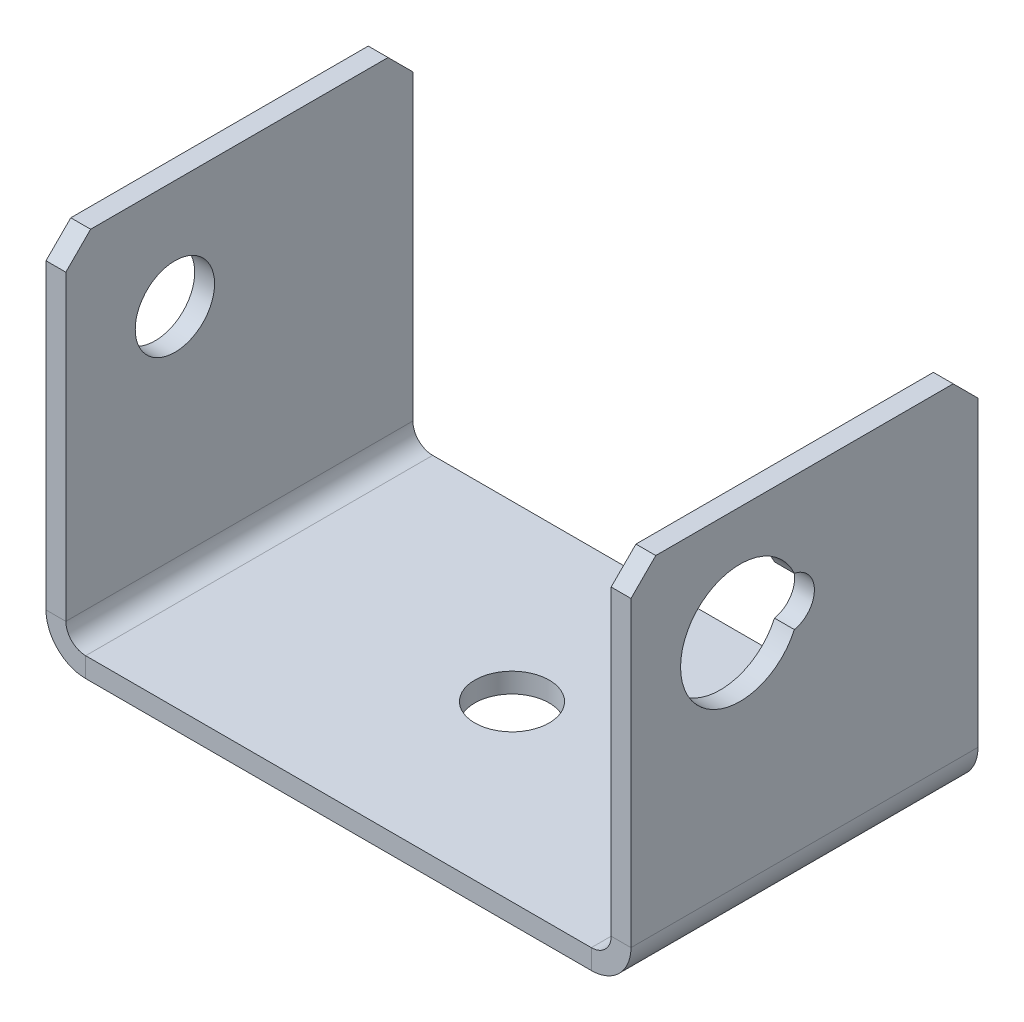
ISO-10303-21;
HEADER;
FILE_DESCRIPTION(('STEP AP214'),'2;1');
FILE_NAME('part.step','',(''),(''),'','','');
FILE_SCHEMA(('AUTOMOTIVE_DESIGN { 1 0 10303 214 1 1 1 1 }'));
ENDSEC;
DATA;
#1=APPLICATION_CONTEXT('core data for automotive mechanical design processes');
#2=APPLICATION_PROTOCOL_DEFINITION('international standard','automotive_design',2000,#1);
#3=PRODUCT_CONTEXT('',#1,'mechanical');
#4=PRODUCT('Part','Part','',(#3));
#5=PRODUCT_RELATED_PRODUCT_CATEGORY('part','',(#4));
#6=PRODUCT_DEFINITION_FORMATION('','',#4);
#7=PRODUCT_DEFINITION_CONTEXT('part definition',#1,'design');
#8=PRODUCT_DEFINITION('design','',#6,#7);
#9=PRODUCT_DEFINITION_SHAPE('','',#8);
#10=(LENGTH_UNIT() NAMED_UNIT(*) SI_UNIT(.MILLI.,.METRE.));
#11=(NAMED_UNIT(*) PLANE_ANGLE_UNIT() SI_UNIT($,.RADIAN.));
#12=(NAMED_UNIT(*) SI_UNIT($,.STERADIAN.) SOLID_ANGLE_UNIT());
#13=UNCERTAINTY_MEASURE_WITH_UNIT(LENGTH_MEASURE(1.E-05),#10,'distance_accuracy_value','');
#14=(GEOMETRIC_REPRESENTATION_CONTEXT(3) GLOBAL_UNCERTAINTY_ASSIGNED_CONTEXT((#13)) GLOBAL_UNIT_ASSIGNED_CONTEXT((#10,
#11,#12)) REPRESENTATION_CONTEXT('',''));
#15=CARTESIAN_POINT('',(0.,0.,0.));
#16=DIRECTION('',(0.,0.,1.));
#17=DIRECTION('',(1.,0.,0.));
#18=AXIS2_PLACEMENT_3D('',#15,#16,#17);
#19=CARTESIAN_POINT('',(2.,-35.,35.));
#20=DIRECTION('',(0.,0.,1.));
#21=DIRECTION('',(1.,0.,0.));
#22=AXIS2_PLACEMENT_3D('',#19,#20,#21);
#23=PLANE('',#22);
#24=DIRECTION('',(0.,-1.,0.));
#25=VECTOR('',#24,1.);
#26=CARTESIAN_POINT('',(2.,-35.,35.));
#27=LINE('',#26,#25);
#28=CARTESIAN_POINT('',(2.,-35.,35.));
#29=VERTEX_POINT('',#28);
#30=CARTESIAN_POINT('',(2.,-37.,35.));
#31=VERTEX_POINT('',#30);
#32=EDGE_CURVE('E304',#29,#31,#27,.T.);
#33=ORIENTED_EDGE('',*,*,#32,.F.);
#34=CARTESIAN_POINT('',(2.,-33.,35.));
#35=DIRECTION('',(0.,0.,-1.));
#36=DIRECTION('',(-1.,0.,0.));
#37=AXIS2_PLACEMENT_3D('',#34,#35,#36);
#38=CIRCLE('',#37,2.);
#39=CARTESIAN_POINT('',(0.,-33.,35.));
#40=VERTEX_POINT('',#39);
#41=EDGE_CURVE('E212',#40,#29,#38,.F.);
#42=ORIENTED_EDGE('',*,*,#41,.F.);
#43=DIRECTION('',(1.,0.,0.));
#44=VECTOR('',#43,1.);
#45=CARTESIAN_POINT('',(-2.,-33.,35.));
#46=LINE('',#45,#44);
#47=CARTESIAN_POINT('',(-2.,-33.,35.));
#48=VERTEX_POINT('',#47);
#49=EDGE_CURVE('E301',#48,#40,#46,.T.);
#50=ORIENTED_EDGE('',*,*,#49,.F.);
#51=CARTESIAN_POINT('',(2.,-33.,35.));
#52=DIRECTION('',(0.,0.,1.));
#53=DIRECTION('',(1.,0.,0.));
#54=AXIS2_PLACEMENT_3D('',#51,#52,#53);
#55=CIRCLE('',#54,4.);
#56=EDGE_CURVE('E219',#48,#31,#55,.T.);
#57=ORIENTED_EDGE('',*,*,#56,.T.);
#58=EDGE_LOOP('',(#33,#42,#50,#57));
#59=FACE_BOUND('',#58,.T.);
#60=ADVANCED_FACE('F45',(#59),#23,.T.);
#61=CARTESIAN_POINT('',(-2.,-33.,35.));
#62=DIRECTION('',(0.,0.,1.));
#63=DIRECTION('',(1.,0.,0.));
#64=AXIS2_PLACEMENT_3D('',#61,#62,#63);
#65=PLANE('',#64);
#66=DIRECTION('',(1.,0.,0.));
#67=VECTOR('',#66,1.);
#68=CARTESIAN_POINT('',(0.,-35.,35.));
#69=LINE('',#68,#67);
#70=CARTESIAN_POINT('',(53.,-35.,35.));
#71=VERTEX_POINT('',#70);
#72=EDGE_CURVE('E209',#29,#71,#69,.T.);
#73=ORIENTED_EDGE('',*,*,#72,.F.);
#74=ORIENTED_EDGE('',*,*,#32,.T.);
#75=DIRECTION('',(1.,0.,0.));
#76=VECTOR('',#75,1.);
#77=CARTESIAN_POINT('',(0.,-37.,35.));
#78=LINE('',#77,#76);
#79=CARTESIAN_POINT('',(53.,-37.,35.));
#80=VERTEX_POINT('',#79);
#81=EDGE_CURVE('E222',#31,#80,#78,.T.);
#82=ORIENTED_EDGE('',*,*,#81,.T.);
#83=DIRECTION('',(0.,1.,0.));
#84=VECTOR('',#83,1.);
#85=CARTESIAN_POINT('',(53.,-37.,35.));
#86=LINE('',#85,#84);
#87=EDGE_CURVE('E292',#80,#71,#86,.T.);
#88=ORIENTED_EDGE('',*,*,#87,.T.);
#89=EDGE_LOOP('',(#73,#74,#82,#88));
#90=FACE_BOUND('',#89,.T.);
#91=ADVANCED_FACE('F371',(#90),#65,.T.);
#92=CARTESIAN_POINT('',(0.,-33.,0.));
#93=DIRECTION('',(0.,0.,-1.));
#94=DIRECTION('',(-1.,0.,0.));
#95=AXIS2_PLACEMENT_3D('',#92,#93,#94);
#96=PLANE('',#95);
#97=DIRECTION('',(-1.,0.,0.));
#98=VECTOR('',#97,1.);
#99=CARTESIAN_POINT('',(0.,-33.,0.));
#100=LINE('',#99,#98);
#101=CARTESIAN_POINT('',(0.,-33.,0.));
#102=VERTEX_POINT('',#101);
#103=CARTESIAN_POINT('',(-2.,-33.,0.));
#104=VERTEX_POINT('',#103);
#105=EDGE_CURVE('E298',#102,#104,#100,.T.);
#106=ORIENTED_EDGE('',*,*,#105,.F.);
#107=CARTESIAN_POINT('',(2.,-33.,0.));
#108=DIRECTION('',(0.,0.,-1.));
#109=DIRECTION('',(-1.,0.,0.));
#110=AXIS2_PLACEMENT_3D('',#107,#108,#109);
#111=CIRCLE('',#110,2.);
#112=CARTESIAN_POINT('',(2.,-35.,0.));
#113=VERTEX_POINT('',#112);
#114=EDGE_CURVE('E240',#102,#113,#111,.F.);
#115=ORIENTED_EDGE('',*,*,#114,.T.);
#116=DIRECTION('',(0.,1.,0.));
#117=VECTOR('',#116,1.);
#118=CARTESIAN_POINT('',(2.,-37.,0.));
#119=LINE('',#118,#117);
#120=CARTESIAN_POINT('',(2.,-37.,0.));
#121=VERTEX_POINT('',#120);
#122=EDGE_CURVE('E296',#121,#113,#119,.T.);
#123=ORIENTED_EDGE('',*,*,#122,.F.);
#124=CARTESIAN_POINT('',(2.,-33.,0.));
#125=DIRECTION('',(0.,0.,1.));
#126=DIRECTION('',(1.,0.,0.));
#127=AXIS2_PLACEMENT_3D('',#124,#125,#126);
#128=CIRCLE('',#127,4.);
#129=EDGE_CURVE('E247',#104,#121,#128,.T.);
#130=ORIENTED_EDGE('',*,*,#129,.F.);
#131=EDGE_LOOP('',(#106,#115,#123,#130));
#132=FACE_BOUND('',#131,.T.);
#133=ADVANCED_FACE('F429',(#132),#96,.T.);
#134=CARTESIAN_POINT('',(2.,-37.,0.));
#135=DIRECTION('',(0.,0.,-1.));
#136=DIRECTION('',(-1.,0.,0.));
#137=AXIS2_PLACEMENT_3D('',#134,#135,#136);
#138=PLANE('',#137);
#139=DIRECTION('',(0.,1.,0.));
#140=VECTOR('',#139,1.);
#141=CARTESIAN_POINT('',(-2.,0.,0.));
#142=LINE('',#141,#140);
#143=CARTESIAN_POINT('',(-2.,-2.5,0.));
#144=VERTEX_POINT('',#143);
#145=EDGE_CURVE('E245',#144,#104,#142,.F.);
#146=ORIENTED_EDGE('',*,*,#145,.F.);
#147=DIRECTION('',(1.,0.,0.));
#148=VECTOR('',#147,1.);
#149=CARTESIAN_POINT('',(2.,-2.5,0.));
#150=LINE('',#149,#148);
#151=CARTESIAN_POINT('',(0.,-2.5,0.));
#152=VERTEX_POINT('',#151);
#153=EDGE_CURVE('E324',#144,#152,#150,.T.);
#154=ORIENTED_EDGE('',*,*,#153,.T.);
#155=DIRECTION('',(0.,-1.,0.));
#156=VECTOR('',#155,1.);
#157=CARTESIAN_POINT('',(0.,0.,0.));
#158=LINE('',#157,#156);
#159=EDGE_CURVE('E243',#152,#102,#158,.T.);
#160=ORIENTED_EDGE('',*,*,#159,.T.);
#161=ORIENTED_EDGE('',*,*,#105,.T.);
#162=EDGE_LOOP('',(#146,#154,#160,#161));
#163=FACE_BOUND('',#162,.T.);
#164=ADVANCED_FACE('F344',(#163),#138,.T.);
#165=CARTESIAN_POINT('',(55.,-33.,35.));
#166=DIRECTION('',(0.,0.,1.));
#167=DIRECTION('',(1.,0.,0.));
#168=AXIS2_PLACEMENT_3D('',#165,#166,#167);
#169=PLANE('',#168);
#170=DIRECTION('',(1.,0.,0.));
#171=VECTOR('',#170,1.);
#172=CARTESIAN_POINT('',(55.,-33.,35.));
#173=LINE('',#172,#171);
#174=CARTESIAN_POINT('',(55.,-33.,35.));
#175=VERTEX_POINT('',#174);
#176=CARTESIAN_POINT('',(57.,-33.,35.));
#177=VERTEX_POINT('',#176);
#178=EDGE_CURVE('E294',#175,#177,#173,.T.);
#179=ORIENTED_EDGE('',*,*,#178,.F.);
#180=CARTESIAN_POINT('',(53.,-33.,35.));
#181=DIRECTION('',(0.,0.,-1.));
#182=DIRECTION('',(-1.,0.,0.));
#183=AXIS2_PLACEMENT_3D('',#180,#181,#182);
#184=CIRCLE('',#183,2.);
#185=EDGE_CURVE('E206',#71,#175,#184,.F.);
#186=ORIENTED_EDGE('',*,*,#185,.F.);
#187=ORIENTED_EDGE('',*,*,#87,.F.);
#188=CARTESIAN_POINT('',(53.,-33.,35.));
#189=DIRECTION('',(0.,0.,1.));
#190=DIRECTION('',(1.,0.,0.));
#191=AXIS2_PLACEMENT_3D('',#188,#189,#190);
#192=CIRCLE('',#191,4.);
#193=EDGE_CURVE('E225',#80,#177,#192,.T.);
#194=ORIENTED_EDGE('',*,*,#193,.T.);
#195=EDGE_LOOP('',(#179,#186,#187,#194));
#196=FACE_BOUND('',#195,.T.);
#197=ADVANCED_FACE('F380',(#196),#169,.T.);
#198=CARTESIAN_POINT('',(53.,-37.,35.));
#199=DIRECTION('',(0.,0.,1.));
#200=DIRECTION('',(1.,0.,0.));
#201=AXIS2_PLACEMENT_3D('',#198,#199,#200);
#202=PLANE('',#201);
#203=DIRECTION('',(0.,1.,0.));
#204=VECTOR('',#203,1.);
#205=CARTESIAN_POINT('',(57.,-35.,35.));
#206=LINE('',#205,#204);
#207=CARTESIAN_POINT('',(57.,-2.50000000000002,35.));
#208=VERTEX_POINT('',#207);
#209=EDGE_CURVE('E199',#177,#208,#206,.T.);
#210=ORIENTED_EDGE('',*,*,#209,.T.);
#211=DIRECTION('',(-1.,0.,0.));
#212=VECTOR('',#211,1.);
#213=CARTESIAN_POINT('',(53.,-2.50000000000002,35.));
#214=LINE('',#213,#212);
#215=CARTESIAN_POINT('',(55.,-2.50000000000002,35.));
#216=VERTEX_POINT('',#215);
#217=EDGE_CURVE('E315',#208,#216,#214,.T.);
#218=ORIENTED_EDGE('',*,*,#217,.T.);
#219=DIRECTION('',(0.,1.,0.));
#220=VECTOR('',#219,1.);
#221=CARTESIAN_POINT('',(55.,-35.,35.));
#222=LINE('',#221,#220);
#223=EDGE_CURVE('E202',#175,#216,#222,.T.);
#224=ORIENTED_EDGE('',*,*,#223,.F.);
#225=ORIENTED_EDGE('',*,*,#178,.T.);
#226=EDGE_LOOP('',(#210,#218,#224,#225));
#227=FACE_BOUND('',#226,.T.);
#228=ADVANCED_FACE('F390',(#227),#202,.T.);
#229=CARTESIAN_POINT('',(53.,-35.,0.));
#230=DIRECTION('',(0.,0.,-1.));
#231=DIRECTION('',(-1.,0.,0.));
#232=AXIS2_PLACEMENT_3D('',#229,#230,#231);
#233=PLANE('',#232);
#234=DIRECTION('',(0.,-1.,0.));
#235=VECTOR('',#234,1.);
#236=CARTESIAN_POINT('',(53.,-35.,0.));
#237=LINE('',#236,#235);
#238=CARTESIAN_POINT('',(53.,-35.,0.));
#239=VERTEX_POINT('',#238);
#240=CARTESIAN_POINT('',(53.,-37.,0.));
#241=VERTEX_POINT('',#240);
#242=EDGE_CURVE('E290',#239,#241,#237,.T.);
#243=ORIENTED_EDGE('',*,*,#242,.F.);
#244=CARTESIAN_POINT('',(53.,-33.,0.));
#245=DIRECTION('',(0.,0.,-1.));
#246=DIRECTION('',(-1.,0.,0.));
#247=AXIS2_PLACEMENT_3D('',#244,#245,#246);
#248=CIRCLE('',#247,2.);
#249=CARTESIAN_POINT('',(55.,-33.,0.));
#250=VERTEX_POINT('',#249);
#251=EDGE_CURVE('E234',#239,#250,#248,.F.);
#252=ORIENTED_EDGE('',*,*,#251,.T.);
#253=DIRECTION('',(-1.,0.,0.));
#254=VECTOR('',#253,1.);
#255=CARTESIAN_POINT('',(57.,-33.,0.));
#256=LINE('',#255,#254);
#257=CARTESIAN_POINT('',(57.,-33.,0.));
#258=VERTEX_POINT('',#257);
#259=EDGE_CURVE('E288',#258,#250,#256,.T.);
#260=ORIENTED_EDGE('',*,*,#259,.F.);
#261=CARTESIAN_POINT('',(53.,-33.,0.));
#262=DIRECTION('',(0.,0.,1.));
#263=DIRECTION('',(1.,0.,0.));
#264=AXIS2_PLACEMENT_3D('',#261,#262,#263);
#265=CIRCLE('',#264,4.);
#266=EDGE_CURVE('E203',#241,#258,#265,.T.);
#267=ORIENTED_EDGE('',*,*,#266,.F.);
#268=EDGE_LOOP('',(#243,#252,#260,#267));
#269=FACE_BOUND('',#268,.T.);
#270=ADVANCED_FACE('F410',(#269),#233,.T.);
#271=CARTESIAN_POINT('',(57.,-33.,0.));
#272=DIRECTION('',(0.,0.,-1.));
#273=DIRECTION('',(-1.,0.,0.));
#274=AXIS2_PLACEMENT_3D('',#271,#272,#273);
#275=PLANE('',#274);
#276=DIRECTION('',(1.,0.,0.));
#277=VECTOR('',#276,1.);
#278=CARTESIAN_POINT('',(0.,-35.,0.));
#279=LINE('',#278,#277);
#280=EDGE_CURVE('E237',#113,#239,#279,.T.);
#281=ORIENTED_EDGE('',*,*,#280,.T.);
#282=ORIENTED_EDGE('',*,*,#242,.T.);
#283=DIRECTION('',(1.,0.,0.));
#284=VECTOR('',#283,1.);
#285=CARTESIAN_POINT('',(0.,-37.,0.));
#286=LINE('',#285,#284);
#287=EDGE_CURVE('E250',#121,#241,#286,.T.);
#288=ORIENTED_EDGE('',*,*,#287,.F.);
#289=ORIENTED_EDGE('',*,*,#122,.T.);
#290=EDGE_LOOP('',(#281,#282,#288,#289));
#291=FACE_BOUND('',#290,.T.);
#292=ADVANCED_FACE('F414',(#291),#275,.T.);
#293=CARTESIAN_POINT('',(57.,-35.,35.));
#294=DIRECTION('',(-1.,0.,0.));
#295=DIRECTION('',(0.,0.,1.));
#296=AXIS2_PLACEMENT_3D('',#293,#294,#295);
#297=PLANE('',#296);
#298=CARTESIAN_POINT('',(57.,-11.,24.));
#299=DIRECTION('',(1.,0.,0.));
#300=DIRECTION('',(0.,0.,-1.));
#301=AXIS2_PLACEMENT_3D('',#298,#299,#300);
#302=CIRCLE('',#301,6.);
#303=CARTESIAN_POINT('',(57.,-8.54553977420696,18.525));
#304=VERTEX_POINT('',#303);
#305=CARTESIAN_POINT('',(57.,-13.454460225793,18.525));
#306=VERTEX_POINT('',#305);
#307=EDGE_CURVE('E185',#304,#306,#302,.T.);
#308=ORIENTED_EDGE('',*,*,#307,.F.);
#309=CARTESIAN_POINT('',(57.,-11.,19.));
#310=DIRECTION('',(1.,0.,0.));
#311=DIRECTION('',(0.,0.,-1.));
#312=AXIS2_PLACEMENT_3D('',#309,#310,#311);
#313=CIRCLE('',#312,2.5);
#314=EDGE_CURVE('E176',#306,#304,#313,.T.);
#315=ORIENTED_EDGE('',*,*,#314,.F.);
#316=EDGE_LOOP('',(#308,#315));
#317=FACE_BOUND('',#316,.T.);
#318=DIRECTION('',(0.,0.,-1.));
#319=VECTOR('',#318,1.);
#320=CARTESIAN_POINT('',(57.,0.,35.));
#321=LINE('',#320,#319);
#322=CARTESIAN_POINT('',(57.,0.,32.5));
#323=VERTEX_POINT('',#322);
#324=CARTESIAN_POINT('',(57.,0.,2.5));
#325=VERTEX_POINT('',#324);
#326=EDGE_CURVE('E285',#323,#325,#321,.T.);
#327=ORIENTED_EDGE('',*,*,#326,.F.);
#328=DIRECTION('',(0.,0.707106781186549,-0.707106781186547));
#329=VECTOR('',#328,1.);
#330=CARTESIAN_POINT('',(57.,0.,32.5));
#331=LINE('',#330,#329);
#332=EDGE_CURVE('E313',#323,#208,#331,.F.);
#333=ORIENTED_EDGE('',*,*,#332,.T.);
#334=ORIENTED_EDGE('',*,*,#209,.F.);
#335=DIRECTION('',(0.,0.,-1.));
#336=VECTOR('',#335,1.);
#337=CARTESIAN_POINT('',(57.,-33.,35.));
#338=LINE('',#337,#336);
#339=EDGE_CURVE('E228',#177,#258,#338,.T.);
#340=ORIENTED_EDGE('',*,*,#339,.T.);
#341=DIRECTION('',(0.,1.,0.));
#342=VECTOR('',#341,1.);
#343=CARTESIAN_POINT('',(57.,-35.,0.));
#344=LINE('',#343,#342);
#345=CARTESIAN_POINT('',(57.,-2.5,0.));
#346=VERTEX_POINT('',#345);
#347=EDGE_CURVE('E189',#258,#346,#344,.T.);
#348=ORIENTED_EDGE('',*,*,#347,.T.);
#349=DIRECTION('',(0.,-0.707106781186548,-0.707106781186548));
#350=VECTOR('',#349,1.);
#351=CARTESIAN_POINT('',(57.,-2.5,0.));
#352=LINE('',#351,#350);
#353=EDGE_CURVE('E311',#346,#325,#352,.F.);
#354=ORIENTED_EDGE('',*,*,#353,.T.);
#355=EDGE_LOOP('',(#327,#333,#334,#340,#348,#354));
#356=FACE_BOUND('',#355,.T.);
#357=ADVANCED_FACE('F191',(#317,#356),#297,.F.);
#358=CARTESIAN_POINT('',(55.,0.,35.));
#359=DIRECTION('',(0.,1.,0.));
#360=DIRECTION('',(0.,0.,1.));
#361=AXIS2_PLACEMENT_3D('',#358,#359,#360);
#362=PLANE('',#361);
#363=DIRECTION('',(0.,0.,-1.));
#364=VECTOR('',#363,1.);
#365=CARTESIAN_POINT('',(55.,0.,35.));
#366=LINE('',#365,#364);
#367=CARTESIAN_POINT('',(55.,0.,32.5));
#368=VERTEX_POINT('',#367);
#369=CARTESIAN_POINT('',(55.,0.,2.5));
#370=VERTEX_POINT('',#369);
#371=EDGE_CURVE('E282',#368,#370,#366,.T.);
#372=ORIENTED_EDGE('',*,*,#371,.F.);
#373=DIRECTION('',(1.,0.,0.));
#374=VECTOR('',#373,1.);
#375=CARTESIAN_POINT('',(55.,0.,32.5));
#376=LINE('',#375,#374);
#377=EDGE_CURVE('E308',#368,#323,#376,.T.);
#378=ORIENTED_EDGE('',*,*,#377,.T.);
#379=ORIENTED_EDGE('',*,*,#326,.T.);
#380=DIRECTION('',(-1.,0.,0.));
#381=VECTOR('',#380,1.);
#382=CARTESIAN_POINT('',(55.,0.,2.5));
#383=LINE('',#382,#381);
#384=EDGE_CURVE('E306',#325,#370,#383,.T.);
#385=ORIENTED_EDGE('',*,*,#384,.T.);
#386=EDGE_LOOP('',(#372,#378,#379,#385));
#387=FACE_BOUND('',#386,.T.);
#388=ADVANCED_FACE('F399',(#387),#362,.T.);
#389=CARTESIAN_POINT('',(55.,-35.,35.));
#390=DIRECTION('',(-1.,0.,0.));
#391=DIRECTION('',(0.,0.,1.));
#392=AXIS2_PLACEMENT_3D('',#389,#390,#391);
#393=PLANE('',#392);
#394=CARTESIAN_POINT('',(55.,-11.,19.));
#395=DIRECTION('',(-1.,0.,0.));
#396=DIRECTION('',(0.,0.,1.));
#397=AXIS2_PLACEMENT_3D('',#394,#395,#396);
#398=CIRCLE('',#397,2.5);
#399=CARTESIAN_POINT('',(55.,-13.454460225793,18.525));
#400=VERTEX_POINT('',#399);
#401=CARTESIAN_POINT('',(55.,-8.54553977420696,18.525));
#402=VERTEX_POINT('',#401);
#403=EDGE_CURVE('E179',#400,#402,#398,.F.);
#404=ORIENTED_EDGE('',*,*,#403,.T.);
#405=CARTESIAN_POINT('',(55.,-11.,24.));
#406=DIRECTION('',(-1.,0.,0.));
#407=DIRECTION('',(0.,0.,1.));
#408=AXIS2_PLACEMENT_3D('',#405,#406,#407);
#409=CIRCLE('',#408,6.);
#410=EDGE_CURVE('E182',#402,#400,#409,.F.);
#411=ORIENTED_EDGE('',*,*,#410,.T.);
#412=EDGE_LOOP('',(#404,#411));
#413=FACE_BOUND('',#412,.T.);
#414=ORIENTED_EDGE('',*,*,#223,.T.);
#415=DIRECTION('',(0.,-0.707106781186549,0.707106781186547));
#416=VECTOR('',#415,1.);
#417=CARTESIAN_POINT('',(55.,-18.7500000000001,51.25));
#418=LINE('',#417,#416);
#419=EDGE_CURVE('E319',#216,#368,#418,.F.);
#420=ORIENTED_EDGE('',*,*,#419,.T.);
#421=ORIENTED_EDGE('',*,*,#371,.T.);
#422=DIRECTION('',(0.,0.707106781186548,0.707106781186548));
#423=VECTOR('',#422,1.);
#424=CARTESIAN_POINT('',(55.,-1.25,1.25));
#425=LINE('',#424,#423);
#426=CARTESIAN_POINT('',(55.,-2.5,0.));
#427=VERTEX_POINT('',#426);
#428=EDGE_CURVE('E317',#370,#427,#425,.F.);
#429=ORIENTED_EDGE('',*,*,#428,.T.);
#430=DIRECTION('',(0.,1.,0.));
#431=VECTOR('',#430,1.);
#432=CARTESIAN_POINT('',(55.,-35.,0.));
#433=LINE('',#432,#431);
#434=EDGE_CURVE('E231',#250,#427,#433,.T.);
#435=ORIENTED_EDGE('',*,*,#434,.F.);
#436=DIRECTION('',(0.,0.,-1.));
#437=VECTOR('',#436,1.);
#438=CARTESIAN_POINT('',(55.,-33.,35.));
#439=LINE('',#438,#437);
#440=EDGE_CURVE('E279',#175,#250,#439,.T.);
#441=ORIENTED_EDGE('',*,*,#440,.F.);
#442=EDGE_LOOP('',(#414,#420,#421,#429,#435,#441));
#443=FACE_BOUND('',#442,.T.);
#444=ADVANCED_FACE('F388',(#413,#443),#393,.T.);
#445=CARTESIAN_POINT('',(53.,-33.,35.));
#446=DIRECTION('',(0.,0.,-1.));
#447=DIRECTION('',(-1.,0.,0.));
#448=AXIS2_PLACEMENT_3D('',#445,#446,#447);
#449=CYLINDRICAL_SURFACE('',#448,2.);
#450=ORIENTED_EDGE('',*,*,#251,.F.);
#451=DIRECTION('',(0.,0.,-1.));
#452=VECTOR('',#451,1.);
#453=CARTESIAN_POINT('',(53.,-35.,35.));
#454=LINE('',#453,#452);
#455=EDGE_CURVE('E276',#71,#239,#454,.T.);
#456=ORIENTED_EDGE('',*,*,#455,.F.);
#457=ORIENTED_EDGE('',*,*,#185,.T.);
#458=ORIENTED_EDGE('',*,*,#440,.T.);
#459=EDGE_LOOP('',(#450,#456,#457,#458));
#460=FACE_BOUND('',#459,.T.);
#461=ADVANCED_FACE('F379',(#460),#449,.F.);
#462=CARTESIAN_POINT('',(0.,-35.,35.));
#463=DIRECTION('',(0.,1.,0.));
#464=DIRECTION('',(0.,0.,1.));
#465=AXIS2_PLACEMENT_3D('',#462,#463,#464);
#466=PLANE('',#465);
#467=CARTESIAN_POINT('',(27.5,-35.,17.5));
#468=DIRECTION('',(0.,1.,0.));
#469=DIRECTION('',(0.,0.,1.));
#470=AXIS2_PLACEMENT_3D('',#467,#468,#469);
#471=CIRCLE('',#470,3.75);
#472=CARTESIAN_POINT('',(27.5,-35.,21.25));
#473=VERTEX_POINT('',#472);
#474=EDGE_CURVE('E740',#473,#473,#471,.T.);
#475=ORIENTED_EDGE('',*,*,#474,.F.);
#476=EDGE_LOOP('',(#475));
#477=FACE_BOUND('',#476,.T.);
#478=ORIENTED_EDGE('',*,*,#280,.F.);
#479=DIRECTION('',(0.,0.,-1.));
#480=VECTOR('',#479,1.);
#481=CARTESIAN_POINT('',(2.,-35.,35.));
#482=LINE('',#481,#480);
#483=EDGE_CURVE('E273',#29,#113,#482,.T.);
#484=ORIENTED_EDGE('',*,*,#483,.F.);
#485=ORIENTED_EDGE('',*,*,#72,.T.);
#486=ORIENTED_EDGE('',*,*,#455,.T.);
#487=EDGE_LOOP('',(#478,#484,#485,#486));
#488=FACE_BOUND('',#487,.T.);
#489=ADVANCED_FACE('F370',(#477,#488),#466,.T.);
#490=CARTESIAN_POINT('',(2.,-33.,35.));
#491=DIRECTION('',(0.,0.,-1.));
#492=DIRECTION('',(-1.,0.,0.));
#493=AXIS2_PLACEMENT_3D('',#490,#491,#492);
#494=CYLINDRICAL_SURFACE('',#493,2.);
#495=ORIENTED_EDGE('',*,*,#114,.F.);
#496=DIRECTION('',(0.,0.,-1.));
#497=VECTOR('',#496,1.);
#498=CARTESIAN_POINT('',(0.,-33.,35.));
#499=LINE('',#498,#497);
#500=EDGE_CURVE('E270',#40,#102,#499,.T.);
#501=ORIENTED_EDGE('',*,*,#500,.F.);
#502=ORIENTED_EDGE('',*,*,#41,.T.);
#503=ORIENTED_EDGE('',*,*,#483,.T.);
#504=EDGE_LOOP('',(#495,#501,#502,#503));
#505=FACE_BOUND('',#504,.T.);
#506=ADVANCED_FACE('F362',(#505),#494,.F.);
#507=CARTESIAN_POINT('',(0.,0.,35.));
#508=DIRECTION('',(1.,0.,0.));
#509=DIRECTION('',(0.,0.,-1.));
#510=AXIS2_PLACEMENT_3D('',#507,#508,#509);
#511=PLANE('',#510);
#512=CARTESIAN_POINT('',(0.,-11.,24.));
#513=DIRECTION('',(1.,0.,0.));
#514=DIRECTION('',(0.,0.,-1.));
#515=AXIS2_PLACEMENT_3D('',#512,#513,#514);
#516=CIRCLE('',#515,4.);
#517=CARTESIAN_POINT('',(0.,-11.,20.));
#518=VERTEX_POINT('',#517);
#519=EDGE_CURVE('E732',#518,#518,#516,.F.);
#520=ORIENTED_EDGE('',*,*,#519,.T.);
#521=EDGE_LOOP('',(#520));
#522=FACE_BOUND('',#521,.T.);
#523=ORIENTED_EDGE('',*,*,#159,.F.);
#524=DIRECTION('',(0.,-0.707106781186548,-0.707106781186548));
#525=VECTOR('',#524,1.);
#526=CARTESIAN_POINT('',(0.,16.25,18.75));
#527=LINE('',#526,#525);
#528=CARTESIAN_POINT('',(0.,0.,2.5));
#529=VERTEX_POINT('',#528);
#530=EDGE_CURVE('E329',#152,#529,#527,.F.);
#531=ORIENTED_EDGE('',*,*,#530,.T.);
#532=DIRECTION('',(0.,0.,-1.));
#533=VECTOR('',#532,1.);
#534=CARTESIAN_POINT('',(0.,0.,35.));
#535=LINE('',#534,#533);
#536=CARTESIAN_POINT('',(0.,0.,32.5));
#537=VERTEX_POINT('',#536);
#538=EDGE_CURVE('E268',#537,#529,#535,.T.);
#539=ORIENTED_EDGE('',*,*,#538,.F.);
#540=DIRECTION('',(0.,-0.707106781186549,0.707106781186547));
#541=VECTOR('',#540,1.);
#542=CARTESIAN_POINT('',(0.,-1.25,33.75));
#543=LINE('',#542,#541);
#544=CARTESIAN_POINT('',(0.,-2.50000000000002,35.));
#545=VERTEX_POINT('',#544);
#546=EDGE_CURVE('E327',#537,#545,#543,.T.);
#547=ORIENTED_EDGE('',*,*,#546,.T.);
#548=DIRECTION('',(0.,-1.,0.));
#549=VECTOR('',#548,1.);
#550=CARTESIAN_POINT('',(0.,0.,35.));
#551=LINE('',#550,#549);
#552=EDGE_CURVE('E215',#545,#40,#551,.T.);
#553=ORIENTED_EDGE('',*,*,#552,.T.);
#554=ORIENTED_EDGE('',*,*,#500,.T.);
#555=EDGE_LOOP('',(#523,#531,#539,#547,#553,#554));
#556=FACE_BOUND('',#555,.T.);
#557=ADVANCED_FACE('F350',(#522,#556),#511,.T.);
#558=CARTESIAN_POINT('',(-2.,0.,35.));
#559=DIRECTION('',(0.,1.,0.));
#560=DIRECTION('',(0.,0.,1.));
#561=AXIS2_PLACEMENT_3D('',#558,#559,#560);
#562=PLANE('',#561);
#563=ORIENTED_EDGE('',*,*,#538,.T.);
#564=DIRECTION('',(-1.,0.,0.));
#565=VECTOR('',#564,1.);
#566=CARTESIAN_POINT('',(-2.,0.,2.5));
#567=LINE('',#566,#565);
#568=CARTESIAN_POINT('',(-2.,0.,2.5));
#569=VERTEX_POINT('',#568);
#570=EDGE_CURVE('E67',#529,#569,#567,.T.);
#571=ORIENTED_EDGE('',*,*,#570,.T.);
#572=DIRECTION('',(0.,0.,-1.));
#573=VECTOR('',#572,1.);
#574=CARTESIAN_POINT('',(-2.,0.,35.));
#575=LINE('',#574,#573);
#576=CARTESIAN_POINT('',(-2.,0.,32.5));
#577=VERTEX_POINT('',#576);
#578=EDGE_CURVE('E266',#577,#569,#575,.T.);
#579=ORIENTED_EDGE('',*,*,#578,.F.);
#580=DIRECTION('',(1.,0.,0.));
#581=VECTOR('',#580,1.);
#582=CARTESIAN_POINT('',(0.,0.,32.5));
#583=LINE('',#582,#581);
#584=EDGE_CURVE('E331',#577,#537,#583,.T.);
#585=ORIENTED_EDGE('',*,*,#584,.T.);
#586=EDGE_LOOP('',(#563,#571,#579,#585));
#587=FACE_BOUND('',#586,.T.);
#588=ADVANCED_FACE('F351',(#587),#562,.T.);
#589=CARTESIAN_POINT('',(-2.,0.,35.));
#590=DIRECTION('',(1.,0.,0.));
#591=DIRECTION('',(0.,0.,-1.));
#592=AXIS2_PLACEMENT_3D('',#589,#590,#591);
#593=PLANE('',#592);
#594=CARTESIAN_POINT('',(-2.,-11.,24.));
#595=DIRECTION('',(-1.,0.,0.));
#596=DIRECTION('',(0.,0.,1.));
#597=AXIS2_PLACEMENT_3D('',#594,#595,#596);
#598=CIRCLE('',#597,4.);
#599=CARTESIAN_POINT('',(-2.,-11.,28.));
#600=VERTEX_POINT('',#599);
#601=EDGE_CURVE('E196',#600,#600,#598,.T.);
#602=ORIENTED_EDGE('',*,*,#601,.F.);
#603=EDGE_LOOP('',(#602));
#604=FACE_BOUND('',#603,.T.);
#605=ORIENTED_EDGE('',*,*,#578,.T.);
#606=DIRECTION('',(0.,0.707106781186548,0.707106781186548));
#607=VECTOR('',#606,1.);
#608=CARTESIAN_POINT('',(-2.,-2.5,0.));
#609=LINE('',#608,#607);
#610=EDGE_CURVE('E54',#569,#144,#609,.F.);
#611=ORIENTED_EDGE('',*,*,#610,.T.);
#612=ORIENTED_EDGE('',*,*,#145,.T.);
#613=DIRECTION('',(0.,0.,-1.));
#614=VECTOR('',#613,1.);
#615=CARTESIAN_POINT('',(-2.,-33.,35.));
#616=LINE('',#615,#614);
#617=EDGE_CURVE('E263',#48,#104,#616,.T.);
#618=ORIENTED_EDGE('',*,*,#617,.F.);
#619=DIRECTION('',(0.,1.,0.));
#620=VECTOR('',#619,1.);
#621=CARTESIAN_POINT('',(-2.,0.,35.));
#622=LINE('',#621,#620);
#623=CARTESIAN_POINT('',(-2.,-2.50000000000002,35.));
#624=VERTEX_POINT('',#623);
#625=EDGE_CURVE('E217',#624,#48,#622,.F.);
#626=ORIENTED_EDGE('',*,*,#625,.F.);
#627=DIRECTION('',(0.,0.707106781186549,-0.707106781186547));
#628=VECTOR('',#627,1.);
#629=CARTESIAN_POINT('',(-2.,0.,32.5));
#630=LINE('',#629,#628);
#631=EDGE_CURVE('E335',#624,#577,#630,.T.);
#632=ORIENTED_EDGE('',*,*,#631,.T.);
#633=EDGE_LOOP('',(#605,#611,#612,#618,#626,#632));
#634=FACE_BOUND('',#633,.T.);
#635=ADVANCED_FACE('F339',(#604,#634),#593,.F.);
#636=CARTESIAN_POINT('',(2.,-33.,35.));
#637=DIRECTION('',(0.,0.,-1.));
#638=DIRECTION('',(-1.,0.,0.));
#639=AXIS2_PLACEMENT_3D('',#636,#637,#638);
#640=CYLINDRICAL_SURFACE('',#639,4.);
#641=ORIENTED_EDGE('',*,*,#129,.T.);
#642=DIRECTION('',(0.,0.,-1.));
#643=VECTOR('',#642,1.);
#644=CARTESIAN_POINT('',(2.,-37.,35.));
#645=LINE('',#644,#643);
#646=EDGE_CURVE('E260',#31,#121,#645,.T.);
#647=ORIENTED_EDGE('',*,*,#646,.F.);
#648=ORIENTED_EDGE('',*,*,#56,.F.);
#649=ORIENTED_EDGE('',*,*,#617,.T.);
#650=EDGE_LOOP('',(#641,#647,#648,#649));
#651=FACE_BOUND('',#650,.T.);
#652=ADVANCED_FACE('F549',(#651),#640,.T.);
#653=CARTESIAN_POINT('',(0.,-37.,35.));
#654=DIRECTION('',(0.,1.,0.));
#655=DIRECTION('',(0.,0.,1.));
#656=AXIS2_PLACEMENT_3D('',#653,#654,#655);
#657=PLANE('',#656);
#658=CARTESIAN_POINT('',(27.5,-37.,17.5));
#659=DIRECTION('',(0.,1.,0.));
#660=DIRECTION('',(0.,0.,1.));
#661=AXIS2_PLACEMENT_3D('',#658,#659,#660);
#662=CIRCLE('',#661,3.75);
#663=CARTESIAN_POINT('',(27.5,-37.,21.25));
#664=VERTEX_POINT('',#663);
#665=EDGE_CURVE('E735',#664,#664,#662,.F.);
#666=ORIENTED_EDGE('',*,*,#665,.F.);
#667=EDGE_LOOP('',(#666));
#668=FACE_BOUND('',#667,.T.);
#669=ORIENTED_EDGE('',*,*,#287,.T.);
#670=DIRECTION('',(0.,0.,-1.));
#671=VECTOR('',#670,1.);
#672=CARTESIAN_POINT('',(53.,-37.,35.));
#673=LINE('',#672,#671);
#674=EDGE_CURVE('E257',#80,#241,#673,.T.);
#675=ORIENTED_EDGE('',*,*,#674,.F.);
#676=ORIENTED_EDGE('',*,*,#81,.F.);
#677=ORIENTED_EDGE('',*,*,#646,.T.);
#678=EDGE_LOOP('',(#669,#675,#676,#677));
#679=FACE_BOUND('',#678,.T.);
#680=ADVANCED_FACE('F539',(#668,#679),#657,.F.);
#681=CARTESIAN_POINT('',(53.,-33.,35.));
#682=DIRECTION('',(0.,0.,-1.));
#683=DIRECTION('',(-1.,0.,0.));
#684=AXIS2_PLACEMENT_3D('',#681,#682,#683);
#685=CYLINDRICAL_SURFACE('',#684,4.);
#686=ORIENTED_EDGE('',*,*,#266,.T.);
#687=ORIENTED_EDGE('',*,*,#339,.F.);
#688=ORIENTED_EDGE('',*,*,#193,.F.);
#689=ORIENTED_EDGE('',*,*,#674,.T.);
#690=EDGE_LOOP('',(#686,#687,#688,#689));
#691=FACE_BOUND('',#690,.T.);
#692=ADVANCED_FACE('F412',(#691),#685,.T.);
#693=CARTESIAN_POINT('',(53.,-33.,35.));
#694=DIRECTION('',(0.,0.,-1.));
#695=DIRECTION('',(-1.,0.,0.));
#696=AXIS2_PLACEMENT_3D('',#693,#694,#695);
#697=PLANE('',#696);
#698=ORIENTED_EDGE('',*,*,#552,.F.);
#699=DIRECTION('',(-1.,0.,0.));
#700=VECTOR('',#699,1.);
#701=CARTESIAN_POINT('',(-2.,-2.50000000000002,35.));
#702=LINE('',#701,#700);
#703=EDGE_CURVE('E11',#545,#624,#702,.T.);
#704=ORIENTED_EDGE('',*,*,#703,.T.);
#705=ORIENTED_EDGE('',*,*,#625,.T.);
#706=ORIENTED_EDGE('',*,*,#49,.T.);
#707=EDGE_LOOP('',(#698,#704,#705,#706));
#708=FACE_BOUND('',#707,.T.);
#709=ADVANCED_FACE('F355',(#708),#697,.F.);
#710=CARTESIAN_POINT('',(53.,-33.,0.));
#711=DIRECTION('',(0.,0.,-1.));
#712=DIRECTION('',(-1.,0.,0.));
#713=AXIS2_PLACEMENT_3D('',#710,#711,#712);
#714=PLANE('',#713);
#715=ORIENTED_EDGE('',*,*,#434,.T.);
#716=DIRECTION('',(1.,0.,0.));
#717=VECTOR('',#716,1.);
#718=CARTESIAN_POINT('',(53.,-2.5,0.));
#719=LINE('',#718,#717);
#720=EDGE_CURVE('E321',#427,#346,#719,.T.);
#721=ORIENTED_EDGE('',*,*,#720,.T.);
#722=ORIENTED_EDGE('',*,*,#347,.F.);
#723=ORIENTED_EDGE('',*,*,#259,.T.);
#724=EDGE_LOOP('',(#715,#721,#722,#723));
#725=FACE_BOUND('',#724,.T.);
#726=ADVANCED_FACE('F406',(#725),#714,.T.);
#727=CARTESIAN_POINT('',(-2.001,-11.,19.));
#728=DIRECTION('',(1.,0.,0.));
#729=DIRECTION('',(0.,0.,-1.));
#730=AXIS2_PLACEMENT_3D('',#727,#728,#729);
#731=CYLINDRICAL_SURFACE('',#730,2.5);
#732=DIRECTION('',(1.,0.,0.));
#733=VECTOR('',#732,1.);
#734=CARTESIAN_POINT('',(-2.001,-13.454460225793,18.525));
#735=LINE('',#734,#733);
#736=EDGE_CURVE('E171',#400,#306,#735,.T.);
#737=ORIENTED_EDGE('',*,*,#736,.T.);
#738=ORIENTED_EDGE('',*,*,#314,.T.);
#739=DIRECTION('',(1.,0.,0.));
#740=VECTOR('',#739,1.);
#741=CARTESIAN_POINT('',(-2.001,-8.54553977420696,18.525));
#742=LINE('',#741,#740);
#743=EDGE_CURVE('E187',#402,#304,#742,.T.);
#744=ORIENTED_EDGE('',*,*,#743,.F.);
#745=ORIENTED_EDGE('',*,*,#403,.F.);
#746=EDGE_LOOP('',(#737,#738,#744,#745));
#747=FACE_BOUND('',#746,.T.);
#748=ADVANCED_FACE('F173',(#747),#731,.F.);
#749=CARTESIAN_POINT('',(-2.001,-11.,24.));
#750=DIRECTION('',(1.,0.,0.));
#751=DIRECTION('',(0.,0.,-1.));
#752=AXIS2_PLACEMENT_3D('',#749,#750,#751);
#753=CYLINDRICAL_SURFACE('',#752,6.);
#754=ORIENTED_EDGE('',*,*,#743,.T.);
#755=ORIENTED_EDGE('',*,*,#307,.T.);
#756=ORIENTED_EDGE('',*,*,#736,.F.);
#757=ORIENTED_EDGE('',*,*,#410,.F.);
#758=EDGE_LOOP('',(#754,#755,#756,#757));
#759=FACE_BOUND('',#758,.T.);
#760=ADVANCED_FACE('F186',(#759),#753,.F.);
#761=CARTESIAN_POINT('',(57.001,-11.,24.));
#762=DIRECTION('',(-1.,0.,0.));
#763=DIRECTION('',(0.,0.,1.));
#764=AXIS2_PLACEMENT_3D('',#761,#762,#763);
#765=CYLINDRICAL_SURFACE('',#764,4.);
#766=ORIENTED_EDGE('',*,*,#519,.F.);
#767=EDGE_LOOP('',(#766));
#768=FACE_BOUND('',#767,.T.);
#769=ORIENTED_EDGE('',*,*,#601,.T.);
#770=EDGE_LOOP('',(#769));
#771=FACE_BOUND('',#770,.T.);
#772=ADVANCED_FACE('F479',(#768,#771),#765,.F.);
#773=CARTESIAN_POINT('',(27.5,-37.001,17.5));
#774=DIRECTION('',(0.,1.,0.));
#775=DIRECTION('',(0.,0.,1.));
#776=AXIS2_PLACEMENT_3D('',#773,#774,#775);
#777=CYLINDRICAL_SURFACE('',#776,3.75);
#778=ORIENTED_EDGE('',*,*,#474,.T.);
#779=EDGE_LOOP('',(#778));
#780=FACE_BOUND('',#779,.T.);
#781=ORIENTED_EDGE('',*,*,#665,.T.);
#782=EDGE_LOOP('',(#781));
#783=FACE_BOUND('',#782,.T.);
#784=ADVANCED_FACE('F439',(#780,#783),#777,.F.);
#785=CARTESIAN_POINT('',(55.,0.,32.5));
#786=DIRECTION('',(0.,-0.707106781186546,-0.707106781186548));
#787=DIRECTION('',(1.,0.,0.));
#788=AXIS2_PLACEMENT_3D('',#785,#786,#787);
#789=PLANE('',#788);
#790=ORIENTED_EDGE('',*,*,#419,.F.);
#791=ORIENTED_EDGE('',*,*,#217,.F.);
#792=ORIENTED_EDGE('',*,*,#332,.F.);
#793=ORIENTED_EDGE('',*,*,#377,.F.);
#794=EDGE_LOOP('',(#790,#791,#792,#793));
#795=FACE_BOUND('',#794,.T.);
#796=ADVANCED_FACE('F394',(#795),#789,.F.);
#797=CARTESIAN_POINT('',(53.,-2.5,0.));
#798=DIRECTION('',(0.,-0.707106781186547,0.707106781186547));
#799=DIRECTION('',(1.,0.,0.));
#800=AXIS2_PLACEMENT_3D('',#797,#798,#799);
#801=PLANE('',#800);
#802=ORIENTED_EDGE('',*,*,#428,.F.);
#803=ORIENTED_EDGE('',*,*,#384,.F.);
#804=ORIENTED_EDGE('',*,*,#353,.F.);
#805=ORIENTED_EDGE('',*,*,#720,.F.);
#806=EDGE_LOOP('',(#802,#803,#804,#805));
#807=FACE_BOUND('',#806,.T.);
#808=ADVANCED_FACE('F403',(#807),#801,.F.);
#809=CARTESIAN_POINT('',(2.,-2.5,0.));
#810=DIRECTION('',(0.,-0.707106781186547,0.707106781186547));
#811=DIRECTION('',(1.,0.,0.));
#812=AXIS2_PLACEMENT_3D('',#809,#810,#811);
#813=PLANE('',#812);
#814=ORIENTED_EDGE('',*,*,#610,.F.);
#815=ORIENTED_EDGE('',*,*,#570,.F.);
#816=ORIENTED_EDGE('',*,*,#530,.F.);
#817=ORIENTED_EDGE('',*,*,#153,.F.);
#818=EDGE_LOOP('',(#814,#815,#816,#817));
#819=FACE_BOUND('',#818,.T.);
#820=ADVANCED_FACE('F347',(#819),#813,.F.);
#821=CARTESIAN_POINT('',(-2.,0.,32.5));
#822=DIRECTION('',(0.,0.707106781186546,0.707106781186548));
#823=DIRECTION('',(-1.,0.,0.));
#824=AXIS2_PLACEMENT_3D('',#821,#822,#823);
#825=PLANE('',#824);
#826=ORIENTED_EDGE('',*,*,#631,.F.);
#827=ORIENTED_EDGE('',*,*,#703,.F.);
#828=ORIENTED_EDGE('',*,*,#546,.F.);
#829=ORIENTED_EDGE('',*,*,#584,.F.);
#830=EDGE_LOOP('',(#826,#827,#828,#829));
#831=FACE_BOUND('',#830,.T.);
#832=ADVANCED_FACE('F48',(#831),#825,.T.);
#833=CLOSED_SHELL('',(#60,#91,#133,#164,#197,#228,#270,#292,#357,#388,#444,#461,#489,#506,#557,
#588,#635,#652,#680,#692,#709,#726,#748,#760,#772,#784,#796,#808,#820,#832));
#834=MANIFOLD_SOLID_BREP('B2',#833);
#835=ADVANCED_BREP_SHAPE_REPRESENTATION('',(#18,#834),#14);
#836=SHAPE_DEFINITION_REPRESENTATION(#9,#835);
ENDSEC;
END-ISO-10303-21;
